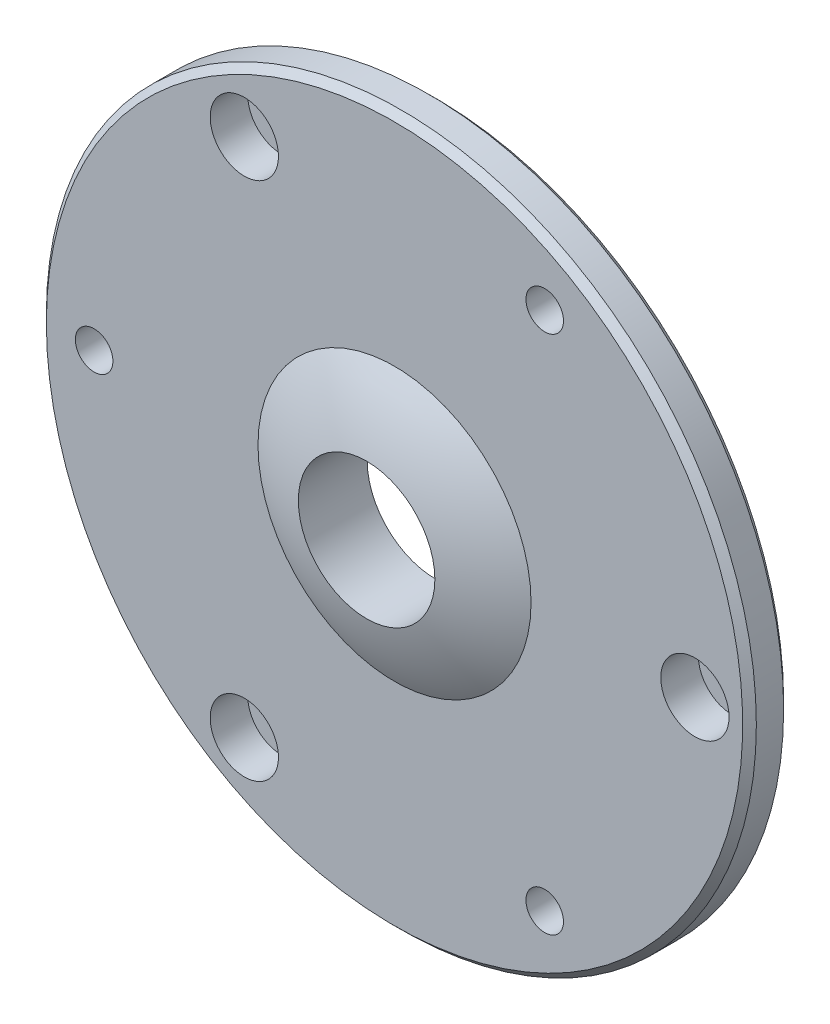
ISO-10303-21;
HEADER;
FILE_DESCRIPTION(('STEP AP214'),'2;1');
FILE_NAME('part.step','',(''),(''),'','','');
FILE_SCHEMA(('AUTOMOTIVE_DESIGN { 1 0 10303 214 1 1 1 1 }'));
ENDSEC;
DATA;
#1=APPLICATION_CONTEXT('core data for automotive mechanical design processes');
#2=APPLICATION_PROTOCOL_DEFINITION('international standard','automotive_design',2000,#1);
#3=PRODUCT_CONTEXT('',#1,'mechanical');
#4=PRODUCT('Part','Part','',(#3));
#5=PRODUCT_RELATED_PRODUCT_CATEGORY('part','',(#4));
#6=PRODUCT_DEFINITION_FORMATION('','',#4);
#7=PRODUCT_DEFINITION_CONTEXT('part definition',#1,'design');
#8=PRODUCT_DEFINITION('design','',#6,#7);
#9=PRODUCT_DEFINITION_SHAPE('','',#8);
#10=(LENGTH_UNIT() NAMED_UNIT(*) SI_UNIT(.MILLI.,.METRE.));
#11=(NAMED_UNIT(*) PLANE_ANGLE_UNIT() SI_UNIT($,.RADIAN.));
#12=(NAMED_UNIT(*) SI_UNIT($,.STERADIAN.) SOLID_ANGLE_UNIT());
#13=UNCERTAINTY_MEASURE_WITH_UNIT(LENGTH_MEASURE(1.E-05),#10,'distance_accuracy_value','');
#14=(GEOMETRIC_REPRESENTATION_CONTEXT(3) GLOBAL_UNCERTAINTY_ASSIGNED_CONTEXT((#13)) GLOBAL_UNIT_ASSIGNED_CONTEXT((#10,
#11,#12)) REPRESENTATION_CONTEXT('',''));
#15=CARTESIAN_POINT('',(0.,0.,0.));
#16=DIRECTION('',(0.,0.,1.));
#17=DIRECTION('',(1.,0.,0.));
#18=AXIS2_PLACEMENT_3D('',#15,#16,#17);
#19=CARTESIAN_POINT('',(10.,0.,0.));
#20=DIRECTION('',(0.,0.,1.));
#21=DIRECTION('',(1.,0.,0.));
#22=AXIS2_PLACEMENT_3D('',#19,#20,#21);
#23=PLANE('',#22);
#24=CARTESIAN_POINT('',(0.,0.,0.));
#25=DIRECTION('',(0.,0.,-1.));
#26=DIRECTION('',(-1.,0.,0.));
#27=AXIS2_PLACEMENT_3D('',#24,#25,#26);
#28=CIRCLE('',#27,10.);
#29=CARTESIAN_POINT('',(-10.,0.,0.));
#30=VERTEX_POINT('',#29);
#31=EDGE_CURVE('E62',#30,#30,#28,.T.);
#32=ORIENTED_EDGE('',*,*,#31,.F.);
#33=EDGE_LOOP('',(#32));
#34=FACE_BOUND('',#33,.T.);
#35=CARTESIAN_POINT('',(0.,0.,0.));
#36=DIRECTION('',(0.,0.,1.));
#37=DIRECTION('',(1.,0.,0.));
#38=AXIS2_PLACEMENT_3D('',#35,#36,#37);
#39=CIRCLE('',#38,33.1);
#40=CARTESIAN_POINT('',(33.1,0.,0.));
#41=VERTEX_POINT('',#40);
#42=EDGE_CURVE('E132',#41,#41,#39,.T.);
#43=ORIENTED_EDGE('',*,*,#42,.F.);
#44=EDGE_LOOP('',(#43));
#45=FACE_BOUND('',#44,.T.);
#46=ADVANCED_FACE('F41',(#34,#45),#23,.F.);
#47=CARTESIAN_POINT('',(-22.,-38.1051177665153,10.088817));
#48=DIRECTION('',(0.,0.,-1.));
#49=DIRECTION('',(-1.,0.,0.));
#50=AXIS2_PLACEMENT_3D('',#47,#48,#49);
#51=CYLINDRICAL_SURFACE('',#50,2.75);
#52=CARTESIAN_POINT('',(-22.,-38.1051177665153,0.));
#53=DIRECTION('',(0.,0.,1.));
#54=DIRECTION('',(1.,0.,0.));
#55=AXIS2_PLACEMENT_3D('',#52,#53,#54);
#56=CIRCLE('',#55,2.75);
#57=CARTESIAN_POINT('',(-19.25,-38.1051177665153,0.));
#58=VERTEX_POINT('',#57);
#59=EDGE_CURVE('E96',#58,#58,#56,.T.);
#60=ORIENTED_EDGE('',*,*,#59,.F.);
#61=EDGE_LOOP('',(#60));
#62=FACE_BOUND('',#61,.T.);
#63=CARTESIAN_POINT('',(-22.,-38.1051177665153,0.5));
#64=DIRECTION('',(0.,0.,1.));
#65=DIRECTION('',(1.,0.,0.));
#66=AXIS2_PLACEMENT_3D('',#63,#64,#65);
#67=CIRCLE('',#66,2.75);
#68=CARTESIAN_POINT('',(-19.25,-38.1051177665153,0.5));
#69=VERTEX_POINT('',#68);
#70=EDGE_CURVE('E67',#69,#69,#67,.T.);
#71=ORIENTED_EDGE('',*,*,#70,.T.);
#72=EDGE_LOOP('',(#71));
#73=FACE_BOUND('',#72,.T.);
#74=ADVANCED_FACE('F149',(#62,#73),#51,.F.);
#75=CARTESIAN_POINT('',(-22.,38.1051177665153,10.088817));
#76=DIRECTION('',(0.,0.,-1.));
#77=DIRECTION('',(-1.,0.,0.));
#78=AXIS2_PLACEMENT_3D('',#75,#76,#77);
#79=CYLINDRICAL_SURFACE('',#78,2.75);
#80=CARTESIAN_POINT('',(-22.,38.1051177665153,0.));
#81=DIRECTION('',(0.,0.,1.));
#82=DIRECTION('',(1.,0.,0.));
#83=AXIS2_PLACEMENT_3D('',#80,#81,#82);
#84=CIRCLE('',#83,2.75);
#85=CARTESIAN_POINT('',(-19.25,38.1051177665153,0.));
#86=VERTEX_POINT('',#85);
#87=EDGE_CURVE('E108',#86,#86,#84,.T.);
#88=ORIENTED_EDGE('',*,*,#87,.F.);
#89=EDGE_LOOP('',(#88));
#90=FACE_BOUND('',#89,.T.);
#91=CARTESIAN_POINT('',(-22.,38.1051177665153,0.5));
#92=DIRECTION('',(0.,0.,1.));
#93=DIRECTION('',(1.,0.,0.));
#94=AXIS2_PLACEMENT_3D('',#91,#92,#93);
#95=CIRCLE('',#94,2.75);
#96=CARTESIAN_POINT('',(-19.25,38.1051177665153,0.5));
#97=VERTEX_POINT('',#96);
#98=EDGE_CURVE('E75',#97,#97,#95,.T.);
#99=ORIENTED_EDGE('',*,*,#98,.T.);
#100=EDGE_LOOP('',(#99));
#101=FACE_BOUND('',#100,.T.);
#102=ADVANCED_FACE('F158',(#90,#101),#79,.F.);
#103=CARTESIAN_POINT('',(44.,0.,10.088817));
#104=DIRECTION('',(0.,0.,-1.));
#105=DIRECTION('',(-1.,0.,0.));
#106=AXIS2_PLACEMENT_3D('',#103,#104,#105);
#107=CYLINDRICAL_SURFACE('',#106,2.75);
#108=CARTESIAN_POINT('',(44.,0.,0.));
#109=DIRECTION('',(0.,0.,1.));
#110=DIRECTION('',(1.,0.,0.));
#111=AXIS2_PLACEMENT_3D('',#108,#109,#110);
#112=CIRCLE('',#111,2.75);
#113=CARTESIAN_POINT('',(46.75,0.,0.));
#114=VERTEX_POINT('',#113);
#115=EDGE_CURVE('E105',#114,#114,#112,.T.);
#116=ORIENTED_EDGE('',*,*,#115,.F.);
#117=EDGE_LOOP('',(#116));
#118=FACE_BOUND('',#117,.T.);
#119=CARTESIAN_POINT('',(44.,0.,0.5));
#120=DIRECTION('',(0.,0.,1.));
#121=DIRECTION('',(1.,0.,0.));
#122=AXIS2_PLACEMENT_3D('',#119,#120,#121);
#123=CIRCLE('',#122,2.75);
#124=CARTESIAN_POINT('',(46.75,0.,0.5));
#125=VERTEX_POINT('',#124);
#126=EDGE_CURVE('E82',#125,#125,#123,.T.);
#127=ORIENTED_EDGE('',*,*,#126,.T.);
#128=EDGE_LOOP('',(#127));
#129=FACE_BOUND('',#128,.T.);
#130=ADVANCED_FACE('F173',(#118,#129),#107,.F.);
#131=CARTESIAN_POINT('',(0.,0.,0.));
#132=DIRECTION('',(0.,0.,-1.));
#133=DIRECTION('',(-1.,0.,0.));
#134=AXIS2_PLACEMENT_3D('',#131,#132,#133);
#135=CYLINDRICAL_SURFACE('',#134,10.);
#136=CARTESIAN_POINT('',(0.,0.,10.088817));
#137=DIRECTION('',(0.,0.,-1.));
#138=DIRECTION('',(-1.,0.,0.));
#139=AXIS2_PLACEMENT_3D('',#136,#137,#138);
#140=CIRCLE('',#139,10.);
#141=CARTESIAN_POINT('',(9.99999999999998,0.,10.088817));
#142=VERTEX_POINT('',#141);
#143=EDGE_CURVE('E102',#142,#142,#140,.T.);
#144=ORIENTED_EDGE('',*,*,#143,.F.);
#145=EDGE_LOOP('',(#144));
#146=FACE_BOUND('',#145,.T.);
#147=ORIENTED_EDGE('',*,*,#31,.T.);
#148=EDGE_LOOP('',(#147));
#149=FACE_BOUND('',#148,.T.);
#150=ADVANCED_FACE('F166',(#146,#149),#135,.F.);
#151=CARTESIAN_POINT('',(0.,0.,0.));
#152=DIRECTION('',(0.,0.,1.));
#153=DIRECTION('',(1.,0.,0.));
#154=AXIS2_PLACEMENT_3D('',#151,#152,#153);
#155=CIRCLE('',#154,51.);
#156=CARTESIAN_POINT('',(51.,0.,0.));
#157=VERTEX_POINT('',#156);
#158=EDGE_CURVE('E10',#157,#157,#155,.F.);
#159=ORIENTED_EDGE('',*,*,#158,.T.);
#160=EDGE_LOOP('',(#159));
#161=FACE_BOUND('',#160,.T.);
#162=CARTESIAN_POINT('',(0.,0.,0.));
#163=DIRECTION('',(0.,0.,1.));
#164=DIRECTION('',(1.,0.,0.));
#165=AXIS2_PLACEMENT_3D('',#162,#163,#164);
#166=CIRCLE('',#165,36.9);
#167=CARTESIAN_POINT('',(36.9,0.,0.));
#168=VERTEX_POINT('',#167);
#169=EDGE_CURVE('E126',#168,#168,#166,.T.);
#170=ORIENTED_EDGE('',*,*,#169,.T.);
#171=EDGE_LOOP('',(#170));
#172=FACE_BOUND('',#171,.T.);
#173=CARTESIAN_POINT('',(22.,-38.1051177665153,0.));
#174=DIRECTION('',(0.,0.,1.));
#175=DIRECTION('',(1.,0.,0.));
#176=AXIS2_PLACEMENT_3D('',#173,#174,#175);
#177=CIRCLE('',#176,2.75);
#178=CARTESIAN_POINT('',(24.75,-38.1051177665153,0.));
#179=VERTEX_POINT('',#178);
#180=EDGE_CURVE('E81',#179,#179,#177,.T.);
#181=ORIENTED_EDGE('',*,*,#180,.T.);
#182=EDGE_LOOP('',(#181));
#183=FACE_BOUND('',#182,.T.);
#184=CARTESIAN_POINT('',(-44.,0.,0.));
#185=DIRECTION('',(0.,0.,1.));
#186=DIRECTION('',(1.,0.,0.));
#187=AXIS2_PLACEMENT_3D('',#184,#185,#186);
#188=CIRCLE('',#187,2.75);
#189=CARTESIAN_POINT('',(-41.25,0.,0.));
#190=VERTEX_POINT('',#189);
#191=EDGE_CURVE('E88',#190,#190,#188,.T.);
#192=ORIENTED_EDGE('',*,*,#191,.T.);
#193=EDGE_LOOP('',(#192));
#194=FACE_BOUND('',#193,.T.);
#195=CARTESIAN_POINT('',(22.,38.1051177665153,0.));
#196=DIRECTION('',(0.,0.,1.));
#197=DIRECTION('',(1.,0.,0.));
#198=AXIS2_PLACEMENT_3D('',#195,#196,#197);
#199=CIRCLE('',#198,2.75);
#200=CARTESIAN_POINT('',(24.75,38.1051177665153,0.));
#201=VERTEX_POINT('',#200);
#202=EDGE_CURVE('E92',#201,#201,#199,.T.);
#203=ORIENTED_EDGE('',*,*,#202,.T.);
#204=EDGE_LOOP('',(#203));
#205=FACE_BOUND('',#204,.T.);
#206=ORIENTED_EDGE('',*,*,#59,.T.);
#207=EDGE_LOOP('',(#206));
#208=FACE_BOUND('',#207,.T.);
#209=ORIENTED_EDGE('',*,*,#87,.T.);
#210=EDGE_LOOP('',(#209));
#211=FACE_BOUND('',#210,.T.);
#212=ORIENTED_EDGE('',*,*,#115,.T.);
#213=EDGE_LOOP('',(#212));
#214=FACE_BOUND('',#213,.T.);
#215=ADVANCED_FACE('F152',(#161,#172,#183,#194,#205,#208,#211,#214),#23,.F.);
#216=CARTESIAN_POINT('',(0.,0.,0.));
#217=DIRECTION('',(0.,0.,-1.));
#218=DIRECTION('',(-1.,0.,0.));
#219=AXIS2_PLACEMENT_3D('',#216,#217,#218);
#220=CYLINDRICAL_SURFACE('',#219,52.);
#221=CARTESIAN_POINT('',(0.,0.,5.00000000000001));
#222=DIRECTION('',(0.,0.,-1.));
#223=DIRECTION('',(-1.,0.,0.));
#224=AXIS2_PLACEMENT_3D('',#221,#222,#223);
#225=CIRCLE('',#224,52.);
#226=CARTESIAN_POINT('',(-52.,0.,5.00000000000001));
#227=VERTEX_POINT('',#226);
#228=EDGE_CURVE('E53',#227,#227,#225,.T.);
#229=ORIENTED_EDGE('',*,*,#228,.T.);
#230=EDGE_LOOP('',(#229));
#231=FACE_BOUND('',#230,.T.);
#232=CARTESIAN_POINT('',(0.,0.,1.00000000000001));
#233=DIRECTION('',(0.,0.,1.));
#234=DIRECTION('',(1.,0.,0.));
#235=AXIS2_PLACEMENT_3D('',#232,#233,#234);
#236=CIRCLE('',#235,52.);
#237=CARTESIAN_POINT('',(52.,0.,1.00000000000001));
#238=VERTEX_POINT('',#237);
#239=EDGE_CURVE('E57',#238,#238,#236,.T.);
#240=ORIENTED_EDGE('',*,*,#239,.T.);
#241=EDGE_LOOP('',(#240));
#242=FACE_BOUND('',#241,.T.);
#243=ADVANCED_FACE('F165',(#231,#242),#220,.T.);
#244=CARTESIAN_POINT('',(52.,0.,6.));
#245=DIRECTION('',(0.,0.,-1.));
#246=DIRECTION('',(-1.,0.,0.));
#247=AXIS2_PLACEMENT_3D('',#244,#245,#246);
#248=PLANE('',#247);
#249=CARTESIAN_POINT('',(0.,0.,6.));
#250=DIRECTION('',(0.,0.,-1.));
#251=DIRECTION('',(-1.,0.,0.));
#252=AXIS2_PLACEMENT_3D('',#249,#250,#251);
#253=CIRCLE('',#252,51.);
#254=CARTESIAN_POINT('',(-51.,0.,6.));
#255=VERTEX_POINT('',#254);
#256=EDGE_CURVE('E49',#255,#255,#253,.F.);
#257=ORIENTED_EDGE('',*,*,#256,.T.);
#258=EDGE_LOOP('',(#257));
#259=FACE_BOUND('',#258,.T.);
#260=CARTESIAN_POINT('',(-22.,-38.1051177665153,6.));
#261=DIRECTION('',(0.,0.,-1.));
#262=DIRECTION('',(-1.,0.,0.));
#263=AXIS2_PLACEMENT_3D('',#260,#261,#262);
#264=CIRCLE('',#263,5.);
#265=CARTESIAN_POINT('',(-17.,-38.1051177665153,6.));
#266=VERTEX_POINT('',#265);
#267=EDGE_CURVE('E63',#266,#266,#264,.T.);
#268=ORIENTED_EDGE('',*,*,#267,.T.);
#269=EDGE_LOOP('',(#268));
#270=FACE_BOUND('',#269,.T.);
#271=CARTESIAN_POINT('',(-22.,38.1051177665153,6.));
#272=DIRECTION('',(0.,0.,-1.));
#273=DIRECTION('',(-1.,0.,0.));
#274=AXIS2_PLACEMENT_3D('',#271,#272,#273);
#275=CIRCLE('',#274,5.);
#276=CARTESIAN_POINT('',(-17.,38.1051177665153,6.));
#277=VERTEX_POINT('',#276);
#278=EDGE_CURVE('E71',#277,#277,#275,.T.);
#279=ORIENTED_EDGE('',*,*,#278,.T.);
#280=EDGE_LOOP('',(#279));
#281=FACE_BOUND('',#280,.T.);
#282=CARTESIAN_POINT('',(44.,0.,6.));
#283=DIRECTION('',(0.,0.,-1.));
#284=DIRECTION('',(-1.,0.,0.));
#285=AXIS2_PLACEMENT_3D('',#282,#283,#284);
#286=CIRCLE('',#285,5.);
#287=CARTESIAN_POINT('',(49.,0.,6.));
#288=VERTEX_POINT('',#287);
#289=EDGE_CURVE('E78',#288,#288,#286,.T.);
#290=ORIENTED_EDGE('',*,*,#289,.T.);
#291=EDGE_LOOP('',(#290));
#292=FACE_BOUND('',#291,.T.);
#293=CARTESIAN_POINT('',(22.,-38.1051177665153,6.));
#294=DIRECTION('',(0.,0.,-1.));
#295=DIRECTION('',(-1.,0.,0.));
#296=AXIS2_PLACEMENT_3D('',#293,#294,#295);
#297=CIRCLE('',#296,2.75);
#298=CARTESIAN_POINT('',(19.25,-38.1051177665153,6.));
#299=VERTEX_POINT('',#298);
#300=EDGE_CURVE('E85',#299,#299,#297,.F.);
#301=ORIENTED_EDGE('',*,*,#300,.F.);
#302=EDGE_LOOP('',(#301));
#303=FACE_BOUND('',#302,.T.);
#304=CARTESIAN_POINT('',(-44.,0.,6.));
#305=DIRECTION('',(0.,0.,-1.));
#306=DIRECTION('',(-1.,0.,0.));
#307=AXIS2_PLACEMENT_3D('',#304,#305,#306);
#308=CIRCLE('',#307,2.75);
#309=CARTESIAN_POINT('',(-46.75,0.,6.));
#310=VERTEX_POINT('',#309);
#311=EDGE_CURVE('E89',#310,#310,#308,.F.);
#312=ORIENTED_EDGE('',*,*,#311,.F.);
#313=EDGE_LOOP('',(#312));
#314=FACE_BOUND('',#313,.T.);
#315=CARTESIAN_POINT('',(22.,38.1051177665153,6.));
#316=DIRECTION('',(0.,0.,-1.));
#317=DIRECTION('',(-1.,0.,0.));
#318=AXIS2_PLACEMENT_3D('',#315,#316,#317);
#319=CIRCLE('',#318,2.75);
#320=CARTESIAN_POINT('',(19.25,38.1051177665153,6.));
#321=VERTEX_POINT('',#320);
#322=EDGE_CURVE('E93',#321,#321,#319,.F.);
#323=ORIENTED_EDGE('',*,*,#322,.F.);
#324=EDGE_LOOP('',(#323));
#325=FACE_BOUND('',#324,.T.);
#326=CARTESIAN_POINT('',(0.,0.,6.));
#327=DIRECTION('',(0.,0.,-1.));
#328=DIRECTION('',(-1.,0.,0.));
#329=AXIS2_PLACEMENT_3D('',#326,#327,#328);
#330=CIRCLE('',#329,20.);
#331=CARTESIAN_POINT('',(20.,0.,6.));
#332=VERTEX_POINT('',#331);
#333=EDGE_CURVE('E99',#332,#332,#330,.T.);
#334=ORIENTED_EDGE('',*,*,#333,.T.);
#335=EDGE_LOOP('',(#334));
#336=FACE_BOUND('',#335,.T.);
#337=ADVANCED_FACE('F170',(#259,#270,#281,#292,#303,#314,#325,#336),#248,.F.);
#338=CARTESIAN_POINT('',(-3.46687522440048E-06,0.,-28.6410275732582));
#339=DIRECTION('',(0.,0.,-1.));
#340=DIRECTION('',(1.,0.,0.));
#341=AXIS2_PLACEMENT_3D('',#338,#339,#340);
#342=SPHERICAL_SURFACE('',#341,40.0000116250765);
#343=CARTESIAN_POINT('',(20.,0.,6.));
#344=CARTESIAN_POINT('',(19.9022407030399,0.,6.05644136179163));
#345=CARTESIAN_POINT('',(19.8042424722404,0.,6.11246887760811));
#346=CARTESIAN_POINT('',(19.6077751937114,0.,6.22369224846815));
#347=CARTESIAN_POINT('',(19.5093061459821,0.,6.27888810351171));
#348=CARTESIAN_POINT('',(19.3119042843429,0.,6.38844418400324));
#349=CARTESIAN_POINT('',(19.2129714704331,0.,6.44280440945122));
#350=CARTESIAN_POINT('',(19.0146491694655,0.,6.55068533779614));
#351=CARTESIAN_POINT('',(18.9152596824077,0.,6.60420604069308));
#352=CARTESIAN_POINT('',(18.7160311584865,0.,6.71040408687441));
#353=CARTESIAN_POINT('',(18.616192121623,0.,6.7630814301588));
#354=CARTESIAN_POINT('',(18.4160716543038,0.,6.86758898164899));
#355=CARTESIAN_POINT('',(18.315790223848,0.,6.9194191898548));
#356=CARTESIAN_POINT('',(18.1147921570928,0.,7.02222875613394));
#357=CARTESIAN_POINT('',(18.0140755207933,0.,7.07320811420727));
#358=CARTESIAN_POINT('',(17.8122142613396,0.,7.17431232623553));
#359=CARTESIAN_POINT('',(17.7110696381854,0.,7.22443718019045));
#360=CARTESIAN_POINT('',(17.5083596546753,0.,7.32382879122144));
#361=CARTESIAN_POINT('',(17.4067942943193,0.,7.37309554829751));
#362=CARTESIAN_POINT('',(17.2032501162189,0.,7.47076743432134));
#363=CARTESIAN_POINT('',(17.1012712984744,0.,7.5191725632691));
#364=CARTESIAN_POINT('',(16.8969075150441,0.,7.61511772354344));
#365=CARTESIAN_POINT('',(16.7945225493583,0.,7.66265775487002));
#366=CARTESIAN_POINT('',(16.5893538086039,0.,7.7568693124164));
#367=CARTESIAN_POINT('',(16.4865700335354,0.,7.8035408386362));
#368=CARTESIAN_POINT('',(16.2806110411594,0.,7.89601204073442));
#369=CARTESIAN_POINT('',(16.1774358238519,0.,7.94181171661283));
#370=CARTESIAN_POINT('',(15.9707013421987,0.,8.03253593528454));
#371=CARTESIAN_POINT('',(15.867142077853,0.,8.07746047807784));
#372=CARTESIAN_POINT('',(15.659646924851,0.,8.16643121056174));
#373=CARTESIAN_POINT('',(15.5557110361948,0.,8.21047740025234));
#374=CARTESIAN_POINT('',(15.3474700842946,0.,8.29768826947024));
#375=CARTESIAN_POINT('',(15.2431650210507,0.,8.34085294899753));
#376=CARTESIAN_POINT('',(15.0341931961588,0.,8.42629770401143));
#377=CARTESIAN_POINT('',(14.9295264345109,0.,8.46857777949803));
#378=CARTESIAN_POINT('',(14.7198387149199,0.,8.55225029595816));
#379=CARTESIAN_POINT('',(14.6148177569769,0.,8.5936427369317));
#380=CARTESIAN_POINT('',(14.4044291722921,0.,8.67553701751552));
#381=CARTESIAN_POINT('',(14.2990615455503,0.,8.71603885712582));
#382=CARTESIAN_POINT('',(14.0879871756121,0.,8.79614903196786));
#383=CARTESIAN_POINT('',(13.9822804324157,0.,8.83575736719961));
#384=CARTESIAN_POINT('',(13.7705354062191,0.,8.9140776943122));
#385=CARTESIAN_POINT('',(13.6644971232188,0.,8.95278968619304));
#386=CARTESIAN_POINT('',(13.4520966178288,0.,9.02931455187788));
#387=CARTESIAN_POINT('',(13.345734395439,0.,9.06712742568189));
#388=CARTESIAN_POINT('',(13.1326936349027,0.,9.14185134493233));
#389=CARTESIAN_POINT('',(13.0260150967562,0.,9.17876239037878));
#390=CARTESIAN_POINT('',(12.812349351012,0.,9.25168000727342));
#391=CARTESIAN_POINT('',(12.7053621434142,0.,9.28768657872162));
#392=CARTESIAN_POINT('',(12.4910867271965,0.,9.35879266680653));
#393=CARTESIAN_POINT('',(12.3837985185766,0.,9.39389218344323));
#394=CARTESIAN_POINT('',(12.16892879032,0.,9.46318164611264));
#395=CARTESIAN_POINT('',(12.0613472706833,0.,9.49737159214535));
#396=CARTESIAN_POINT('',(11.8458986314156,0.,9.56483946298428));
#397=CARTESIAN_POINT('',(11.7380315117845,0.,9.59811738779051));
#398=CARTESIAN_POINT('',(11.5220194040455,0.,9.66375883101554));
#399=CARTESIAN_POINT('',(11.4138744159374,0.,9.69612234943435));
#400=CARTESIAN_POINT('',(11.1973143225873,0.,9.75993265992362));
#401=CARTESIAN_POINT('',(11.0888992173451,0.,9.79137945199407));
#402=CARTESIAN_POINT('',(10.8718066607707,0.,9.8533540568062));
#403=CARTESIAN_POINT('',(10.7631292094384,0.,9.88388186954787));
#404=CARTESIAN_POINT('',(10.5455197492619,0.,9.94401632383958));
#405=CARTESIAN_POINT('',(10.4365877404176,0.,9.97362296538962));
#406=CARTESIAN_POINT('',(10.21847697678,0.,10.0319129691933));
#407=CARTESIAN_POINT('',(10.1092982219866,0.,10.060596331447));
#408=CARTESIAN_POINT('',(9.99999999999998,0.,10.088817));
#409=B_SPLINE_CURVE_WITH_KNOTS('',3,(#343,#344,#345,#346,#347,#348,#349,#350,#351,#352,#353,
#354,#355,#356,#357,#358,#359,#360,#361,#362,#363,#364,#365,#366,#367,#368,#369,#370,#371,#372,
#373,#374,#375,#376,#377,#378,#379,#380,#381,#382,#383,#384,#385,#386,#387,#388,#389,#390,#391,
#392,#393,#394,#395,#396,#397,#398,#399,#400,#401,#402,#403,#404,#405,#406,#407,#408),
.UNSPECIFIED.,.F.,.F.,(4,2,2,2,2,2,2,2,2,2,2,2,2,2,2,2,2,2,2,2,2,2,2,2,2,2,2,2,2,2,2,2,4),(0.,
0.338647134875512,0.677294269751021,1.01594140462654,1.35458853950205,1.69323567437757,
2.03188280925307,2.37052994412858,2.70917707900411,3.04782421387962,3.38647134875513,
3.72511848363064,4.06376561850615,4.40241275338166,4.74105988825718,5.07970702313269,
5.4183541580082,5.75700129288372,6.09564842775923,6.43429556263475,6.77294269751026,
7.11158983238577,7.45023696726128,7.78888410213679,8.1275312370123,8.46617837188782,
8.80482550676333,9.14347264163885,9.48211977651436,9.82076691138988,10.1594140462654,
10.4980611811409,10.8367083160164),.UNSPECIFIED.);
#410=EDGE_CURVE('BSEAM211',#332,#142,#409,.T.);
#411=ORIENTED_EDGE('',*,*,#333,.F.);
#412=ORIENTED_EDGE('',*,*,#143,.T.);
#413=ORIENTED_EDGE('',*,*,#410,.T.);
#414=ORIENTED_EDGE('',*,*,#410,.F.);
#415=EDGE_LOOP('',(#411,#413,#412,#414));
#416=FACE_BOUND('',#415,.T.);
#417=ADVANCED_FACE('F211',(#416),#342,.T.);
#418=CARTESIAN_POINT('',(22.,38.1051177665153,10.088817));
#419=DIRECTION('',(0.,0.,-1.));
#420=DIRECTION('',(-1.,0.,0.));
#421=AXIS2_PLACEMENT_3D('',#418,#419,#420);
#422=CYLINDRICAL_SURFACE('',#421,2.75);
#423=ORIENTED_EDGE('',*,*,#202,.F.);
#424=EDGE_LOOP('',(#423));
#425=FACE_BOUND('',#424,.T.);
#426=ORIENTED_EDGE('',*,*,#322,.T.);
#427=EDGE_LOOP('',(#426));
#428=FACE_BOUND('',#427,.T.);
#429=ADVANCED_FACE('F223',(#425,#428),#422,.F.);
#430=CARTESIAN_POINT('',(-44.,0.,10.088817));
#431=DIRECTION('',(0.,0.,-1.));
#432=DIRECTION('',(-1.,0.,0.));
#433=AXIS2_PLACEMENT_3D('',#430,#431,#432);
#434=CYLINDRICAL_SURFACE('',#433,2.75);
#435=ORIENTED_EDGE('',*,*,#191,.F.);
#436=EDGE_LOOP('',(#435));
#437=FACE_BOUND('',#436,.T.);
#438=ORIENTED_EDGE('',*,*,#311,.T.);
#439=EDGE_LOOP('',(#438));
#440=FACE_BOUND('',#439,.T.);
#441=ADVANCED_FACE('F230',(#437,#440),#434,.F.);
#442=CARTESIAN_POINT('',(22.,-38.1051177665153,10.088817));
#443=DIRECTION('',(0.,0.,-1.));
#444=DIRECTION('',(-1.,0.,0.));
#445=AXIS2_PLACEMENT_3D('',#442,#443,#444);
#446=CYLINDRICAL_SURFACE('',#445,2.75);
#447=ORIENTED_EDGE('',*,*,#180,.F.);
#448=EDGE_LOOP('',(#447));
#449=FACE_BOUND('',#448,.T.);
#450=ORIENTED_EDGE('',*,*,#300,.T.);
#451=EDGE_LOOP('',(#450));
#452=FACE_BOUND('',#451,.T.);
#453=ADVANCED_FACE('F205',(#449,#452),#446,.F.);
#454=CARTESIAN_POINT('',(44.,0.,0.5));
#455=DIRECTION('',(0.,0.,1.));
#456=DIRECTION('',(1.,0.,0.));
#457=AXIS2_PLACEMENT_3D('',#454,#455,#456);
#458=CYLINDRICAL_SURFACE('',#457,5.);
#459=CARTESIAN_POINT('',(44.,0.,0.5));
#460=DIRECTION('',(0.,0.,1.));
#461=DIRECTION('',(1.,0.,0.));
#462=AXIS2_PLACEMENT_3D('',#459,#460,#461);
#463=CIRCLE('',#462,5.);
#464=CARTESIAN_POINT('',(49.,0.,0.5));
#465=VERTEX_POINT('',#464);
#466=EDGE_CURVE('E74',#465,#465,#463,.T.);
#467=CARTESIAN_POINT('',(49.,0.,0.5));
#468=CARTESIAN_POINT('',(49.,0.,0.557291666666666));
#469=CARTESIAN_POINT('',(49.,0.,0.614583333333333));
#470=CARTESIAN_POINT('',(49.,0.,0.729166666666666));
#471=CARTESIAN_POINT('',(49.,0.,0.786458333333333));
#472=CARTESIAN_POINT('',(49.,0.,0.901041666666666));
#473=CARTESIAN_POINT('',(49.,0.,0.958333333333333));
#474=CARTESIAN_POINT('',(49.,0.,1.07291666666667));
#475=CARTESIAN_POINT('',(49.,0.,1.13020833333333));
#476=CARTESIAN_POINT('',(49.,0.,1.24479166666667));
#477=CARTESIAN_POINT('',(49.,0.,1.30208333333333));
#478=CARTESIAN_POINT('',(49.,0.,1.41666666666667));
#479=CARTESIAN_POINT('',(49.,0.,1.47395833333333));
#480=CARTESIAN_POINT('',(49.,0.,1.58854166666667));
#481=CARTESIAN_POINT('',(49.,0.,1.64583333333333));
#482=CARTESIAN_POINT('',(49.,0.,1.76041666666667));
#483=CARTESIAN_POINT('',(49.,0.,1.81770833333333));
#484=CARTESIAN_POINT('',(49.,0.,1.93229166666667));
#485=CARTESIAN_POINT('',(49.,0.,1.98958333333333));
#486=CARTESIAN_POINT('',(49.,0.,2.10416666666667));
#487=CARTESIAN_POINT('',(49.,0.,2.16145833333333));
#488=CARTESIAN_POINT('',(49.,0.,2.27604166666667));
#489=CARTESIAN_POINT('',(49.,0.,2.33333333333333));
#490=CARTESIAN_POINT('',(49.,0.,2.44791666666667));
#491=CARTESIAN_POINT('',(49.,0.,2.50520833333333));
#492=CARTESIAN_POINT('',(49.,0.,2.61979166666667));
#493=CARTESIAN_POINT('',(49.,0.,2.67708333333333));
#494=CARTESIAN_POINT('',(49.,0.,2.79166666666667));
#495=CARTESIAN_POINT('',(49.,0.,2.84895833333333));
#496=CARTESIAN_POINT('',(49.,0.,2.96354166666667));
#497=CARTESIAN_POINT('',(49.,0.,3.02083333333333));
#498=CARTESIAN_POINT('',(49.,0.,3.13541666666667));
#499=CARTESIAN_POINT('',(49.,0.,3.19270833333333));
#500=CARTESIAN_POINT('',(49.,0.,3.30729166666667));
#501=CARTESIAN_POINT('',(49.,0.,3.36458333333333));
#502=CARTESIAN_POINT('',(49.,0.,3.47916666666667));
#503=CARTESIAN_POINT('',(49.,0.,3.53645833333333));
#504=CARTESIAN_POINT('',(49.,0.,3.65104166666667));
#505=CARTESIAN_POINT('',(49.,0.,3.70833333333333));
#506=CARTESIAN_POINT('',(49.,0.,3.82291666666667));
#507=CARTESIAN_POINT('',(49.,0.,3.88020833333333));
#508=CARTESIAN_POINT('',(49.,0.,3.99479166666667));
#509=CARTESIAN_POINT('',(49.,0.,4.05208333333333));
#510=CARTESIAN_POINT('',(49.,0.,4.16666666666667));
#511=CARTESIAN_POINT('',(49.,0.,4.22395833333333));
#512=CARTESIAN_POINT('',(49.,0.,4.33854166666667));
#513=CARTESIAN_POINT('',(49.,0.,4.39583333333333));
#514=CARTESIAN_POINT('',(49.,0.,4.51041666666667));
#515=CARTESIAN_POINT('',(49.,0.,4.56770833333333));
#516=CARTESIAN_POINT('',(49.,0.,4.68229166666667));
#517=CARTESIAN_POINT('',(49.,0.,4.73958333333333));
#518=CARTESIAN_POINT('',(49.,0.,4.85416666666667));
#519=CARTESIAN_POINT('',(49.,0.,4.91145833333333));
#520=CARTESIAN_POINT('',(49.,0.,5.02604166666667));
#521=CARTESIAN_POINT('',(49.,0.,5.08333333333333));
#522=CARTESIAN_POINT('',(49.,0.,5.19791666666667));
#523=CARTESIAN_POINT('',(49.,0.,5.25520833333333));
#524=CARTESIAN_POINT('',(49.,0.,5.36979166666667));
#525=CARTESIAN_POINT('',(49.,0.,5.42708333333333));
#526=CARTESIAN_POINT('',(49.,0.,5.54166666666667));
#527=CARTESIAN_POINT('',(49.,0.,5.59895833333333));
#528=CARTESIAN_POINT('',(49.,0.,5.71354166666667));
#529=CARTESIAN_POINT('',(49.,0.,5.77083333333333));
#530=CARTESIAN_POINT('',(49.,0.,5.88541666666667));
#531=CARTESIAN_POINT('',(49.,0.,5.94270833333333));
#532=CARTESIAN_POINT('',(49.,0.,6.));
#533=B_SPLINE_CURVE_WITH_KNOTS('',3,(#467,#468,#469,#470,#471,#472,#473,#474,#475,#476,#477,
#478,#479,#480,#481,#482,#483,#484,#485,#486,#487,#488,#489,#490,#491,#492,#493,#494,#495,#496,
#497,#498,#499,#500,#501,#502,#503,#504,#505,#506,#507,#508,#509,#510,#511,#512,#513,#514,#515,
#516,#517,#518,#519,#520,#521,#522,#523,#524,#525,#526,#527,#528,#529,#530,#531,#532),
.UNSPECIFIED.,.F.,.F.,(4,2,2,2,2,2,2,2,2,2,2,2,2,2,2,2,2,2,2,2,2,2,2,2,2,2,2,2,2,2,2,2,4),(0.,
0.171875,0.34375,0.515625,0.6875,0.859375,1.03125,1.203125,1.375,1.546875,1.71875,1.890625,
2.0625,2.234375,2.40625,2.578125,2.75,2.921875,3.09375,3.265625,3.4375,3.609375,3.78125,
3.953125,4.125,4.296875,4.46875,4.640625,4.8125,4.984375,5.15625,5.328125,5.5),.UNSPECIFIED.);
#534=EDGE_CURVE('BSEAM199',#465,#288,#533,.T.);
#535=ORIENTED_EDGE('',*,*,#466,.F.);
#536=ORIENTED_EDGE('',*,*,#289,.F.);
#537=ORIENTED_EDGE('',*,*,#534,.T.);
#538=ORIENTED_EDGE('',*,*,#534,.F.);
#539=EDGE_LOOP('',(#535,#537,#536,#538));
#540=FACE_BOUND('',#539,.T.);
#541=ADVANCED_FACE('F199',(#540),#458,.F.);
#542=CARTESIAN_POINT('',(44.,0.,0.5));
#543=DIRECTION('',(0.,0.,1.));
#544=DIRECTION('',(1.,0.,0.));
#545=AXIS2_PLACEMENT_3D('',#542,#543,#544);
#546=PLANE('',#545);
#547=ORIENTED_EDGE('',*,*,#126,.F.);
#548=EDGE_LOOP('',(#547));
#549=FACE_BOUND('',#548,.T.);
#550=ORIENTED_EDGE('',*,*,#466,.T.);
#551=EDGE_LOOP('',(#550));
#552=FACE_BOUND('',#551,.T.);
#553=ADVANCED_FACE('F195',(#549,#552),#546,.T.);
#554=CARTESIAN_POINT('',(-22.,38.1051177665153,0.5));
#555=DIRECTION('',(0.,0.,1.));
#556=DIRECTION('',(1.,0.,0.));
#557=AXIS2_PLACEMENT_3D('',#554,#555,#556);
#558=CYLINDRICAL_SURFACE('',#557,5.);
#559=CARTESIAN_POINT('',(-22.,38.1051177665153,0.5));
#560=DIRECTION('',(0.,0.,1.));
#561=DIRECTION('',(1.,0.,0.));
#562=AXIS2_PLACEMENT_3D('',#559,#560,#561);
#563=CIRCLE('',#562,5.);
#564=CARTESIAN_POINT('',(-17.,38.1051177665153,0.5));
#565=VERTEX_POINT('',#564);
#566=EDGE_CURVE('E66',#565,#565,#563,.T.);
#567=CARTESIAN_POINT('',(-17.,38.1051177665153,0.5));
#568=CARTESIAN_POINT('',(-17.,38.1051177665153,0.557291666666666));
#569=CARTESIAN_POINT('',(-17.,38.1051177665153,0.614583333333333));
#570=CARTESIAN_POINT('',(-17.,38.1051177665153,0.729166666666666));
#571=CARTESIAN_POINT('',(-17.,38.1051177665153,0.786458333333333));
#572=CARTESIAN_POINT('',(-17.,38.1051177665153,0.901041666666666));
#573=CARTESIAN_POINT('',(-17.,38.1051177665153,0.958333333333333));
#574=CARTESIAN_POINT('',(-17.,38.1051177665153,1.07291666666667));
#575=CARTESIAN_POINT('',(-17.,38.1051177665153,1.13020833333333));
#576=CARTESIAN_POINT('',(-17.,38.1051177665153,1.24479166666667));
#577=CARTESIAN_POINT('',(-17.,38.1051177665153,1.30208333333333));
#578=CARTESIAN_POINT('',(-17.,38.1051177665153,1.41666666666667));
#579=CARTESIAN_POINT('',(-17.,38.1051177665153,1.47395833333333));
#580=CARTESIAN_POINT('',(-17.,38.1051177665153,1.58854166666667));
#581=CARTESIAN_POINT('',(-17.,38.1051177665153,1.64583333333333));
#582=CARTESIAN_POINT('',(-17.,38.1051177665153,1.76041666666667));
#583=CARTESIAN_POINT('',(-17.,38.1051177665153,1.81770833333333));
#584=CARTESIAN_POINT('',(-17.,38.1051177665153,1.93229166666667));
#585=CARTESIAN_POINT('',(-17.,38.1051177665153,1.98958333333333));
#586=CARTESIAN_POINT('',(-17.,38.1051177665153,2.10416666666667));
#587=CARTESIAN_POINT('',(-17.,38.1051177665153,2.16145833333333));
#588=CARTESIAN_POINT('',(-17.,38.1051177665153,2.27604166666667));
#589=CARTESIAN_POINT('',(-17.,38.1051177665153,2.33333333333333));
#590=CARTESIAN_POINT('',(-17.,38.1051177665153,2.44791666666667));
#591=CARTESIAN_POINT('',(-17.,38.1051177665153,2.50520833333333));
#592=CARTESIAN_POINT('',(-17.,38.1051177665153,2.61979166666667));
#593=CARTESIAN_POINT('',(-17.,38.1051177665153,2.67708333333333));
#594=CARTESIAN_POINT('',(-17.,38.1051177665153,2.79166666666667));
#595=CARTESIAN_POINT('',(-17.,38.1051177665153,2.84895833333333));
#596=CARTESIAN_POINT('',(-17.,38.1051177665153,2.96354166666667));
#597=CARTESIAN_POINT('',(-17.,38.1051177665153,3.02083333333333));
#598=CARTESIAN_POINT('',(-17.,38.1051177665153,3.13541666666667));
#599=CARTESIAN_POINT('',(-17.,38.1051177665153,3.19270833333333));
#600=CARTESIAN_POINT('',(-17.,38.1051177665153,3.30729166666667));
#601=CARTESIAN_POINT('',(-17.,38.1051177665153,3.36458333333333));
#602=CARTESIAN_POINT('',(-17.,38.1051177665153,3.47916666666667));
#603=CARTESIAN_POINT('',(-17.,38.1051177665153,3.53645833333333));
#604=CARTESIAN_POINT('',(-17.,38.1051177665153,3.65104166666667));
#605=CARTESIAN_POINT('',(-17.,38.1051177665153,3.70833333333333));
#606=CARTESIAN_POINT('',(-17.,38.1051177665153,3.82291666666667));
#607=CARTESIAN_POINT('',(-17.,38.1051177665153,3.88020833333333));
#608=CARTESIAN_POINT('',(-17.,38.1051177665153,3.99479166666667));
#609=CARTESIAN_POINT('',(-17.,38.1051177665153,4.05208333333333));
#610=CARTESIAN_POINT('',(-17.,38.1051177665153,4.16666666666667));
#611=CARTESIAN_POINT('',(-17.,38.1051177665153,4.22395833333333));
#612=CARTESIAN_POINT('',(-17.,38.1051177665153,4.33854166666667));
#613=CARTESIAN_POINT('',(-17.,38.1051177665153,4.39583333333333));
#614=CARTESIAN_POINT('',(-17.,38.1051177665153,4.51041666666667));
#615=CARTESIAN_POINT('',(-17.,38.1051177665153,4.56770833333333));
#616=CARTESIAN_POINT('',(-17.,38.1051177665153,4.68229166666667));
#617=CARTESIAN_POINT('',(-17.,38.1051177665153,4.73958333333333));
#618=CARTESIAN_POINT('',(-17.,38.1051177665153,4.85416666666667));
#619=CARTESIAN_POINT('',(-17.,38.1051177665153,4.91145833333333));
#620=CARTESIAN_POINT('',(-17.,38.1051177665153,5.02604166666667));
#621=CARTESIAN_POINT('',(-17.,38.1051177665153,5.08333333333333));
#622=CARTESIAN_POINT('',(-17.,38.1051177665153,5.19791666666667));
#623=CARTESIAN_POINT('',(-17.,38.1051177665153,5.25520833333333));
#624=CARTESIAN_POINT('',(-17.,38.1051177665153,5.36979166666667));
#625=CARTESIAN_POINT('',(-17.,38.1051177665153,5.42708333333333));
#626=CARTESIAN_POINT('',(-17.,38.1051177665153,5.54166666666667));
#627=CARTESIAN_POINT('',(-17.,38.1051177665153,5.59895833333333));
#628=CARTESIAN_POINT('',(-17.,38.1051177665153,5.71354166666667));
#629=CARTESIAN_POINT('',(-17.,38.1051177665153,5.77083333333333));
#630=CARTESIAN_POINT('',(-17.,38.1051177665153,5.88541666666667));
#631=CARTESIAN_POINT('',(-17.,38.1051177665153,5.94270833333333));
#632=CARTESIAN_POINT('',(-17.,38.1051177665153,6.));
#633=B_SPLINE_CURVE_WITH_KNOTS('',3,(#567,#568,#569,#570,#571,#572,#573,#574,#575,#576,#577,
#578,#579,#580,#581,#582,#583,#584,#585,#586,#587,#588,#589,#590,#591,#592,#593,#594,#595,#596,
#597,#598,#599,#600,#601,#602,#603,#604,#605,#606,#607,#608,#609,#610,#611,#612,#613,#614,#615,
#616,#617,#618,#619,#620,#621,#622,#623,#624,#625,#626,#627,#628,#629,#630,#631,#632),
.UNSPECIFIED.,.F.,.F.,(4,2,2,2,2,2,2,2,2,2,2,2,2,2,2,2,2,2,2,2,2,2,2,2,2,2,2,2,2,2,2,2,4),(0.,
0.171875,0.34375,0.515625,0.6875,0.859375,1.03125,1.203125,1.375,1.546875,1.71875,1.890625,
2.0625,2.234375,2.40625,2.578125,2.75,2.921875,3.09375,3.265625,3.4375,3.609375,3.78125,
3.953125,4.125,4.296875,4.46875,4.640625,4.8125,4.984375,5.15625,5.328125,5.5),.UNSPECIFIED.);
#634=EDGE_CURVE('BSEAM198',#565,#277,#633,.T.);
#635=ORIENTED_EDGE('',*,*,#566,.F.);
#636=ORIENTED_EDGE('',*,*,#278,.F.);
#637=ORIENTED_EDGE('',*,*,#634,.T.);
#638=ORIENTED_EDGE('',*,*,#634,.F.);
#639=EDGE_LOOP('',(#635,#637,#636,#638));
#640=FACE_BOUND('',#639,.T.);
#641=ADVANCED_FACE('F198',(#640),#558,.F.);
#642=CARTESIAN_POINT('',(-22.,38.1051177665153,0.5));
#643=DIRECTION('',(0.,0.,1.));
#644=DIRECTION('',(1.,0.,0.));
#645=AXIS2_PLACEMENT_3D('',#642,#643,#644);
#646=PLANE('',#645);
#647=ORIENTED_EDGE('',*,*,#98,.F.);
#648=EDGE_LOOP('',(#647));
#649=FACE_BOUND('',#648,.T.);
#650=ORIENTED_EDGE('',*,*,#566,.T.);
#651=EDGE_LOOP('',(#650));
#652=FACE_BOUND('',#651,.T.);
#653=ADVANCED_FACE('F245',(#649,#652),#646,.T.);
#654=CARTESIAN_POINT('',(-22.,-38.1051177665153,0.5));
#655=DIRECTION('',(0.,0.,1.));
#656=DIRECTION('',(1.,0.,0.));
#657=AXIS2_PLACEMENT_3D('',#654,#655,#656);
#658=CYLINDRICAL_SURFACE('',#657,5.);
#659=CARTESIAN_POINT('',(-22.,-38.1051177665153,0.5));
#660=DIRECTION('',(0.,0.,1.));
#661=DIRECTION('',(1.,0.,0.));
#662=AXIS2_PLACEMENT_3D('',#659,#660,#661);
#663=CIRCLE('',#662,5.);
#664=CARTESIAN_POINT('',(-17.,-38.1051177665153,0.5));
#665=VERTEX_POINT('',#664);
#666=EDGE_CURVE('E70',#665,#665,#663,.T.);
#667=CARTESIAN_POINT('',(-17.,-38.1051177665153,0.5));
#668=CARTESIAN_POINT('',(-17.,-38.1051177665153,0.557291666666666));
#669=CARTESIAN_POINT('',(-17.,-38.1051177665153,0.614583333333333));
#670=CARTESIAN_POINT('',(-17.,-38.1051177665153,0.729166666666666));
#671=CARTESIAN_POINT('',(-17.,-38.1051177665153,0.786458333333333));
#672=CARTESIAN_POINT('',(-17.,-38.1051177665153,0.901041666666666));
#673=CARTESIAN_POINT('',(-17.,-38.1051177665153,0.958333333333333));
#674=CARTESIAN_POINT('',(-17.,-38.1051177665153,1.07291666666667));
#675=CARTESIAN_POINT('',(-17.,-38.1051177665153,1.13020833333333));
#676=CARTESIAN_POINT('',(-17.,-38.1051177665153,1.24479166666667));
#677=CARTESIAN_POINT('',(-17.,-38.1051177665153,1.30208333333333));
#678=CARTESIAN_POINT('',(-17.,-38.1051177665153,1.41666666666667));
#679=CARTESIAN_POINT('',(-17.,-38.1051177665153,1.47395833333333));
#680=CARTESIAN_POINT('',(-17.,-38.1051177665153,1.58854166666667));
#681=CARTESIAN_POINT('',(-17.,-38.1051177665153,1.64583333333333));
#682=CARTESIAN_POINT('',(-17.,-38.1051177665153,1.76041666666667));
#683=CARTESIAN_POINT('',(-17.,-38.1051177665153,1.81770833333333));
#684=CARTESIAN_POINT('',(-17.,-38.1051177665153,1.93229166666667));
#685=CARTESIAN_POINT('',(-17.,-38.1051177665153,1.98958333333333));
#686=CARTESIAN_POINT('',(-17.,-38.1051177665153,2.10416666666667));
#687=CARTESIAN_POINT('',(-17.,-38.1051177665153,2.16145833333333));
#688=CARTESIAN_POINT('',(-17.,-38.1051177665153,2.27604166666667));
#689=CARTESIAN_POINT('',(-17.,-38.1051177665153,2.33333333333333));
#690=CARTESIAN_POINT('',(-17.,-38.1051177665153,2.44791666666667));
#691=CARTESIAN_POINT('',(-17.,-38.1051177665153,2.50520833333333));
#692=CARTESIAN_POINT('',(-17.,-38.1051177665153,2.61979166666667));
#693=CARTESIAN_POINT('',(-17.,-38.1051177665153,2.67708333333333));
#694=CARTESIAN_POINT('',(-17.,-38.1051177665153,2.79166666666667));
#695=CARTESIAN_POINT('',(-17.,-38.1051177665153,2.84895833333333));
#696=CARTESIAN_POINT('',(-17.,-38.1051177665153,2.96354166666667));
#697=CARTESIAN_POINT('',(-17.,-38.1051177665153,3.02083333333333));
#698=CARTESIAN_POINT('',(-17.,-38.1051177665153,3.13541666666667));
#699=CARTESIAN_POINT('',(-17.,-38.1051177665153,3.19270833333333));
#700=CARTESIAN_POINT('',(-17.,-38.1051177665153,3.30729166666667));
#701=CARTESIAN_POINT('',(-17.,-38.1051177665153,3.36458333333333));
#702=CARTESIAN_POINT('',(-17.,-38.1051177665153,3.47916666666667));
#703=CARTESIAN_POINT('',(-17.,-38.1051177665153,3.53645833333333));
#704=CARTESIAN_POINT('',(-17.,-38.1051177665153,3.65104166666667));
#705=CARTESIAN_POINT('',(-17.,-38.1051177665153,3.70833333333333));
#706=CARTESIAN_POINT('',(-17.,-38.1051177665153,3.82291666666667));
#707=CARTESIAN_POINT('',(-17.,-38.1051177665153,3.88020833333333));
#708=CARTESIAN_POINT('',(-17.,-38.1051177665153,3.99479166666667));
#709=CARTESIAN_POINT('',(-17.,-38.1051177665153,4.05208333333333));
#710=CARTESIAN_POINT('',(-17.,-38.1051177665153,4.16666666666667));
#711=CARTESIAN_POINT('',(-17.,-38.1051177665153,4.22395833333333));
#712=CARTESIAN_POINT('',(-17.,-38.1051177665153,4.33854166666667));
#713=CARTESIAN_POINT('',(-17.,-38.1051177665153,4.39583333333333));
#714=CARTESIAN_POINT('',(-17.,-38.1051177665153,4.51041666666667));
#715=CARTESIAN_POINT('',(-17.,-38.1051177665153,4.56770833333333));
#716=CARTESIAN_POINT('',(-17.,-38.1051177665153,4.68229166666667));
#717=CARTESIAN_POINT('',(-17.,-38.1051177665153,4.73958333333333));
#718=CARTESIAN_POINT('',(-17.,-38.1051177665153,4.85416666666667));
#719=CARTESIAN_POINT('',(-17.,-38.1051177665153,4.91145833333333));
#720=CARTESIAN_POINT('',(-17.,-38.1051177665153,5.02604166666667));
#721=CARTESIAN_POINT('',(-17.,-38.1051177665153,5.08333333333333));
#722=CARTESIAN_POINT('',(-17.,-38.1051177665153,5.19791666666667));
#723=CARTESIAN_POINT('',(-17.,-38.1051177665153,5.25520833333333));
#724=CARTESIAN_POINT('',(-17.,-38.1051177665153,5.36979166666667));
#725=CARTESIAN_POINT('',(-17.,-38.1051177665153,5.42708333333333));
#726=CARTESIAN_POINT('',(-17.,-38.1051177665153,5.54166666666667));
#727=CARTESIAN_POINT('',(-17.,-38.1051177665153,5.59895833333333));
#728=CARTESIAN_POINT('',(-17.,-38.1051177665153,5.71354166666667));
#729=CARTESIAN_POINT('',(-17.,-38.1051177665153,5.77083333333333));
#730=CARTESIAN_POINT('',(-17.,-38.1051177665153,5.88541666666667));
#731=CARTESIAN_POINT('',(-17.,-38.1051177665153,5.94270833333333));
#732=CARTESIAN_POINT('',(-17.,-38.1051177665153,6.));
#733=B_SPLINE_CURVE_WITH_KNOTS('',3,(#667,#668,#669,#670,#671,#672,#673,#674,#675,#676,#677,
#678,#679,#680,#681,#682,#683,#684,#685,#686,#687,#688,#689,#690,#691,#692,#693,#694,#695,#696,
#697,#698,#699,#700,#701,#702,#703,#704,#705,#706,#707,#708,#709,#710,#711,#712,#713,#714,#715,
#716,#717,#718,#719,#720,#721,#722,#723,#724,#725,#726,#727,#728,#729,#730,#731,#732),
.UNSPECIFIED.,.F.,.F.,(4,2,2,2,2,2,2,2,2,2,2,2,2,2,2,2,2,2,2,2,2,2,2,2,2,2,2,2,2,2,2,2,4),(0.,
0.171875,0.34375,0.515625,0.6875,0.859375,1.03125,1.203125,1.375,1.546875,1.71875,1.890625,
2.0625,2.234375,2.40625,2.578125,2.75,2.921875,3.09375,3.265625,3.4375,3.609375,3.78125,
3.953125,4.125,4.296875,4.46875,4.640625,4.8125,4.984375,5.15625,5.328125,5.5),.UNSPECIFIED.);
#734=EDGE_CURVE('BSEAM249',#665,#266,#733,.T.);
#735=ORIENTED_EDGE('',*,*,#666,.F.);
#736=ORIENTED_EDGE('',*,*,#267,.F.);
#737=ORIENTED_EDGE('',*,*,#734,.T.);
#738=ORIENTED_EDGE('',*,*,#734,.F.);
#739=EDGE_LOOP('',(#735,#737,#736,#738));
#740=FACE_BOUND('',#739,.T.);
#741=ADVANCED_FACE('F249',(#740),#658,.F.);
#742=CARTESIAN_POINT('',(-22.,-38.1051177665153,0.5));
#743=DIRECTION('',(0.,0.,1.));
#744=DIRECTION('',(1.,0.,0.));
#745=AXIS2_PLACEMENT_3D('',#742,#743,#744);
#746=PLANE('',#745);
#747=ORIENTED_EDGE('',*,*,#70,.F.);
#748=EDGE_LOOP('',(#747));
#749=FACE_BOUND('',#748,.T.);
#750=ORIENTED_EDGE('',*,*,#666,.T.);
#751=EDGE_LOOP('',(#750));
#752=FACE_BOUND('',#751,.T.);
#753=ADVANCED_FACE('F253',(#749,#752),#746,.T.);
#754=CARTESIAN_POINT('',(0.,0.,2.4));
#755=DIRECTION('',(0.,0.,1.));
#756=DIRECTION('',(1.,0.,0.));
#757=AXIS2_PLACEMENT_3D('',#754,#755,#756);
#758=PLANE('',#757);
#759=CARTESIAN_POINT('',(0.,0.,2.4));
#760=DIRECTION('',(0.,0.,1.));
#761=DIRECTION('',(1.,0.,0.));
#762=AXIS2_PLACEMENT_3D('',#759,#760,#761);
#763=CIRCLE('',#762,36.9);
#764=CARTESIAN_POINT('',(36.9,0.,2.4));
#765=VERTEX_POINT('',#764);
#766=EDGE_CURVE('E125',#765,#765,#763,.T.);
#767=ORIENTED_EDGE('',*,*,#766,.F.);
#768=EDGE_LOOP('',(#767));
#769=FACE_BOUND('',#768,.T.);
#770=CARTESIAN_POINT('',(0.,0.,2.4));
#771=DIRECTION('',(0.,0.,1.));
#772=DIRECTION('',(1.,0.,0.));
#773=AXIS2_PLACEMENT_3D('',#770,#771,#772);
#774=CIRCLE('',#773,33.1);
#775=CARTESIAN_POINT('',(33.1,0.,2.4));
#776=VERTEX_POINT('',#775);
#777=EDGE_CURVE('E129',#776,#776,#774,.T.);
#778=ORIENTED_EDGE('',*,*,#777,.T.);
#779=EDGE_LOOP('',(#778));
#780=FACE_BOUND('',#779,.T.);
#781=ADVANCED_FACE('F138',(#769,#780),#758,.F.);
#782=CARTESIAN_POINT('',(0.,0.,2.4));
#783=DIRECTION('',(0.,0.,-1.));
#784=DIRECTION('',(-1.,0.,0.));
#785=AXIS2_PLACEMENT_3D('',#782,#783,#784);
#786=CYLINDRICAL_SURFACE('',#785,36.9);
#787=ORIENTED_EDGE('',*,*,#766,.T.);
#788=EDGE_LOOP('',(#787));
#789=FACE_BOUND('',#788,.T.);
#790=ORIENTED_EDGE('',*,*,#169,.F.);
#791=EDGE_LOOP('',(#790));
#792=FACE_BOUND('',#791,.T.);
#793=ADVANCED_FACE('F144',(#789,#792),#786,.F.);
#794=CARTESIAN_POINT('',(0.,0.,2.4));
#795=DIRECTION('',(0.,0.,-1.));
#796=DIRECTION('',(-1.,0.,0.));
#797=AXIS2_PLACEMENT_3D('',#794,#795,#796);
#798=CYLINDRICAL_SURFACE('',#797,33.1);
#799=ORIENTED_EDGE('',*,*,#777,.F.);
#800=EDGE_LOOP('',(#799));
#801=FACE_BOUND('',#800,.T.);
#802=ORIENTED_EDGE('',*,*,#42,.T.);
#803=EDGE_LOOP('',(#802));
#804=FACE_BOUND('',#803,.T.);
#805=ADVANCED_FACE('F140',(#801,#804),#798,.T.);
#806=CARTESIAN_POINT('',(0.,0.,5.00000000000001));
#807=DIRECTION('',(0.,0.,-1.));
#808=DIRECTION('',(-1.,0.,0.));
#809=AXIS2_PLACEMENT_3D('',#806,#807,#808);
#810=CONICAL_SURFACE('',#809,52.,0.785398163397452);
#811=ORIENTED_EDGE('',*,*,#256,.F.);
#812=EDGE_LOOP('',(#811));
#813=FACE_BOUND('',#812,.T.);
#814=ORIENTED_EDGE('',*,*,#228,.F.);
#815=EDGE_LOOP('',(#814));
#816=FACE_BOUND('',#815,.T.);
#817=ADVANCED_FACE('F143',(#813,#816),#810,.T.);
#818=CARTESIAN_POINT('',(0.,0.,0.));
#819=DIRECTION('',(0.,0.,1.));
#820=DIRECTION('',(1.,0.,0.));
#821=AXIS2_PLACEMENT_3D('',#818,#819,#820);
#822=CONICAL_SURFACE('',#821,51.,0.785398163397441);
#823=ORIENTED_EDGE('',*,*,#239,.F.);
#824=EDGE_LOOP('',(#823));
#825=FACE_BOUND('',#824,.T.);
#826=ORIENTED_EDGE('',*,*,#158,.F.);
#827=EDGE_LOOP('',(#826));
#828=FACE_BOUND('',#827,.T.);
#829=ADVANCED_FACE('F44',(#825,#828),#822,.T.);
#830=CLOSED_SHELL('',(#46,#74,#102,#130,#150,#215,#243,#337,#417,#429,#441,#453,#541,#553,#641,
#653,#741,#753,#781,#793,#805,#817,#829));
#831=MANIFOLD_SOLID_BREP('B2',#830);
#832=ADVANCED_BREP_SHAPE_REPRESENTATION('',(#18,#831),#14);
#833=SHAPE_DEFINITION_REPRESENTATION(#9,#832);
ENDSEC;
END-ISO-10303-21;
